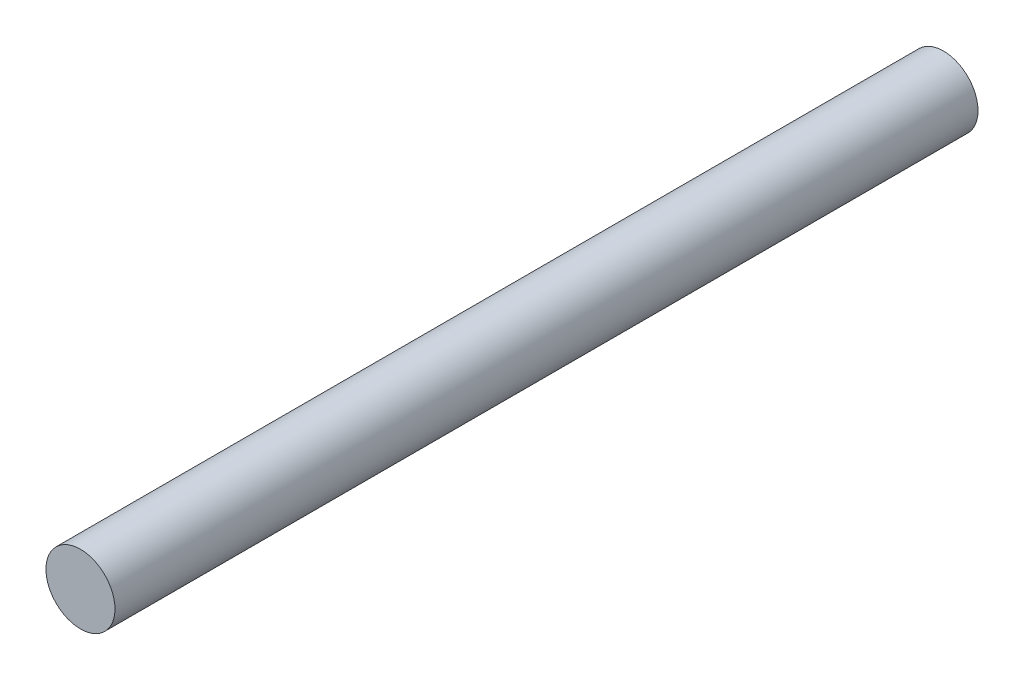
ISO-10303-21;
HEADER;
FILE_DESCRIPTION(('STEP AP214'),'2;1');
FILE_NAME('part.step','',(''),(''),'','','');
FILE_SCHEMA(('AUTOMOTIVE_DESIGN { 1 0 10303 214 1 1 1 1 }'));
ENDSEC;
DATA;
#1=APPLICATION_CONTEXT('core data for automotive mechanical design processes');
#2=APPLICATION_PROTOCOL_DEFINITION('international standard','automotive_design',2000,#1);
#3=PRODUCT_CONTEXT('',#1,'mechanical');
#4=PRODUCT('Part','Part','',(#3));
#5=PRODUCT_RELATED_PRODUCT_CATEGORY('part','',(#4));
#6=PRODUCT_DEFINITION_FORMATION('','',#4);
#7=PRODUCT_DEFINITION_CONTEXT('part definition',#1,'design');
#8=PRODUCT_DEFINITION('design','',#6,#7);
#9=PRODUCT_DEFINITION_SHAPE('','',#8);
#10=(LENGTH_UNIT() NAMED_UNIT(*) SI_UNIT(.MILLI.,.METRE.));
#11=(NAMED_UNIT(*) PLANE_ANGLE_UNIT() SI_UNIT($,.RADIAN.));
#12=(NAMED_UNIT(*) SI_UNIT($,.STERADIAN.) SOLID_ANGLE_UNIT());
#13=UNCERTAINTY_MEASURE_WITH_UNIT(LENGTH_MEASURE(1.E-05),#10,'distance_accuracy_value','');
#14=(GEOMETRIC_REPRESENTATION_CONTEXT(3) GLOBAL_UNCERTAINTY_ASSIGNED_CONTEXT((#13)) GLOBAL_UNIT_ASSIGNED_CONTEXT((#10,
#11,#12)) REPRESENTATION_CONTEXT('',''));
#15=CARTESIAN_POINT('',(0.,0.,0.));
#16=DIRECTION('',(0.,0.,1.));
#17=DIRECTION('',(1.,0.,0.));
#18=AXIS2_PLACEMENT_3D('',#15,#16,#17);
#19=CARTESIAN_POINT('',(0.,0.,40.));
#20=DIRECTION('',(0.,0.,-1.));
#21=DIRECTION('',(-1.,0.,0.));
#22=AXIS2_PLACEMENT_3D('',#19,#20,#21);
#23=CYLINDRICAL_SURFACE('',#22,1.6);
#24=CARTESIAN_POINT('',(0.,0.,40.));
#25=DIRECTION('',(0.,0.,1.));
#26=DIRECTION('',(1.,0.,0.));
#27=AXIS2_PLACEMENT_3D('',#24,#25,#26);
#28=CIRCLE('',#27,1.6);
#29=CARTESIAN_POINT('',(1.6,0.,40.));
#30=VERTEX_POINT('',#29);
#31=EDGE_CURVE('E10',#30,#30,#28,.T.);
#32=ORIENTED_EDGE('',*,*,#31,.F.);
#33=EDGE_LOOP('',(#32));
#34=FACE_BOUND('',#33,.T.);
#35=CARTESIAN_POINT('',(0.,0.,0.));
#36=DIRECTION('',(0.,0.,1.));
#37=DIRECTION('',(1.,0.,0.));
#38=AXIS2_PLACEMENT_3D('',#35,#36,#37);
#39=CIRCLE('',#38,1.6);
#40=CARTESIAN_POINT('',(1.6,0.,0.));
#41=VERTEX_POINT('',#40);
#42=EDGE_CURVE('E34',#41,#41,#39,.T.);
#43=ORIENTED_EDGE('',*,*,#42,.T.);
#44=EDGE_LOOP('',(#43));
#45=FACE_BOUND('',#44,.T.);
#46=ADVANCED_FACE('F31',(#34,#45),#23,.T.);
#47=CARTESIAN_POINT('',(0.,0.,40.));
#48=DIRECTION('',(0.,0.,1.));
#49=DIRECTION('',(1.,0.,0.));
#50=AXIS2_PLACEMENT_3D('',#47,#48,#49);
#51=PLANE('',#50);
#52=ORIENTED_EDGE('',*,*,#31,.T.);
#53=EDGE_LOOP('',(#52));
#54=FACE_BOUND('',#53,.T.);
#55=ADVANCED_FACE('F46',(#54),#51,.T.);
#56=CARTESIAN_POINT('',(0.,0.,0.));
#57=DIRECTION('',(0.,0.,1.));
#58=DIRECTION('',(1.,0.,0.));
#59=AXIS2_PLACEMENT_3D('',#56,#57,#58);
#60=PLANE('',#59);
#61=ORIENTED_EDGE('',*,*,#42,.F.);
#62=EDGE_LOOP('',(#61));
#63=FACE_BOUND('',#62,.T.);
#64=ADVANCED_FACE('F44',(#63),#60,.F.);
#65=CLOSED_SHELL('',(#46,#55,#64));
#66=MANIFOLD_SOLID_BREP('B2',#65);
#67=ADVANCED_BREP_SHAPE_REPRESENTATION('',(#18,#66),#14);
#68=SHAPE_DEFINITION_REPRESENTATION(#9,#67);
ENDSEC;
END-ISO-10303-21;
